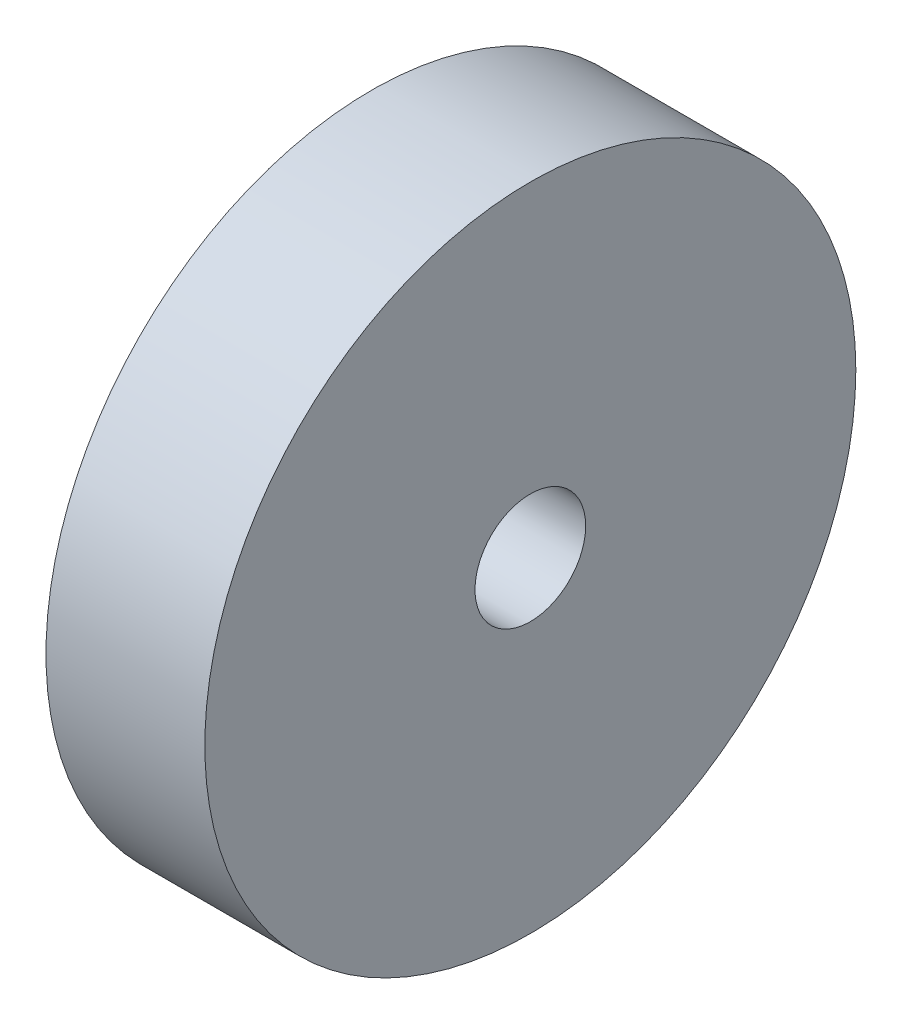
ISO-10303-21;
HEADER;
FILE_DESCRIPTION(('STEP AP214'),'2;1');
FILE_NAME('part.step','',(''),(''),'','','');
FILE_SCHEMA(('AUTOMOTIVE_DESIGN { 1 0 10303 214 1 1 1 1 }'));
ENDSEC;
DATA;
#1=APPLICATION_CONTEXT('core data for automotive mechanical design processes');
#2=APPLICATION_PROTOCOL_DEFINITION('international standard','automotive_design',2000,#1);
#3=PRODUCT_CONTEXT('',#1,'mechanical');
#4=PRODUCT('Part','Part','',(#3));
#5=PRODUCT_RELATED_PRODUCT_CATEGORY('part','',(#4));
#6=PRODUCT_DEFINITION_FORMATION('','',#4);
#7=PRODUCT_DEFINITION_CONTEXT('part definition',#1,'design');
#8=PRODUCT_DEFINITION('design','',#6,#7);
#9=PRODUCT_DEFINITION_SHAPE('','',#8);
#10=(LENGTH_UNIT() NAMED_UNIT(*) SI_UNIT(.MILLI.,.METRE.));
#11=(NAMED_UNIT(*) PLANE_ANGLE_UNIT() SI_UNIT($,.RADIAN.));
#12=(NAMED_UNIT(*) SI_UNIT($,.STERADIAN.) SOLID_ANGLE_UNIT());
#13=UNCERTAINTY_MEASURE_WITH_UNIT(LENGTH_MEASURE(1.E-05),#10,'distance_accuracy_value','');
#14=(GEOMETRIC_REPRESENTATION_CONTEXT(3) GLOBAL_UNCERTAINTY_ASSIGNED_CONTEXT((#13)) GLOBAL_UNIT_ASSIGNED_CONTEXT((#10,
#11,#12)) REPRESENTATION_CONTEXT('',''));
#15=CARTESIAN_POINT('',(0.,0.,0.));
#16=DIRECTION('',(0.,0.,1.));
#17=DIRECTION('',(1.,0.,0.));
#18=AXIS2_PLACEMENT_3D('',#15,#16,#17);
#19=CARTESIAN_POINT('',(6.1976,0.,0.));
#20=DIRECTION('',(-1.,0.,0.));
#21=DIRECTION('',(0.,0.,1.));
#22=AXIS2_PLACEMENT_3D('',#19,#20,#21);
#23=CYLINDRICAL_SURFACE('',#22,6.35);
#24=CARTESIAN_POINT('',(6.1976,0.,0.));
#25=DIRECTION('',(1.,0.,0.));
#26=DIRECTION('',(0.,0.,-1.));
#27=AXIS2_PLACEMENT_3D('',#24,#25,#26);
#28=CIRCLE('',#27,6.35);
#29=CARTESIAN_POINT('',(6.1976,0.,-6.35));
#30=VERTEX_POINT('',#29);
#31=EDGE_CURVE('E10',#30,#30,#28,.T.);
#32=ORIENTED_EDGE('',*,*,#31,.F.);
#33=EDGE_LOOP('',(#32));
#34=FACE_BOUND('',#33,.T.);
#35=CARTESIAN_POINT('',(3.0988,0.,0.));
#36=DIRECTION('',(1.,0.,0.));
#37=DIRECTION('',(0.,0.,-1.));
#38=AXIS2_PLACEMENT_3D('',#35,#36,#37);
#39=CIRCLE('',#38,6.35);
#40=CARTESIAN_POINT('',(3.0988,0.,-6.35));
#41=VERTEX_POINT('',#40);
#42=EDGE_CURVE('E37',#41,#41,#39,.T.);
#43=ORIENTED_EDGE('',*,*,#42,.T.);
#44=EDGE_LOOP('',(#43));
#45=FACE_BOUND('',#44,.T.);
#46=ADVANCED_FACE('F30',(#34,#45),#23,.T.);
#47=CARTESIAN_POINT('',(6.1976,0.,0.));
#48=DIRECTION('',(1.,0.,0.));
#49=DIRECTION('',(0.,0.,-1.));
#50=AXIS2_PLACEMENT_3D('',#47,#48,#49);
#51=PLANE('',#50);
#52=CARTESIAN_POINT('',(6.1976,0.,0.));
#53=DIRECTION('',(1.,0.,0.));
#54=DIRECTION('',(0.,0.,-1.));
#55=AXIS2_PLACEMENT_3D('',#52,#53,#54);
#56=CIRCLE('',#55,1.0795);
#57=CARTESIAN_POINT('',(6.1976,0.,-1.0795));
#58=VERTEX_POINT('',#57);
#59=EDGE_CURVE('E42',#58,#58,#56,.T.);
#60=ORIENTED_EDGE('',*,*,#59,.F.);
#61=EDGE_LOOP('',(#60));
#62=FACE_BOUND('',#61,.T.);
#63=ORIENTED_EDGE('',*,*,#31,.T.);
#64=EDGE_LOOP('',(#63));
#65=FACE_BOUND('',#64,.T.);
#66=ADVANCED_FACE('F59',(#62,#65),#51,.T.);
#67=CARTESIAN_POINT('',(3.0988,0.,0.));
#68=DIRECTION('',(1.,0.,0.));
#69=DIRECTION('',(0.,0.,-1.));
#70=AXIS2_PLACEMENT_3D('',#67,#68,#69);
#71=PLANE('',#70);
#72=CARTESIAN_POINT('',(3.0988,0.,0.));
#73=DIRECTION('',(1.,0.,0.));
#74=DIRECTION('',(0.,0.,-1.));
#75=AXIS2_PLACEMENT_3D('',#72,#73,#74);
#76=CIRCLE('',#75,1.0795);
#77=CARTESIAN_POINT('',(3.0988,0.,-1.0795));
#78=VERTEX_POINT('',#77);
#79=EDGE_CURVE('E33',#78,#78,#76,.T.);
#80=ORIENTED_EDGE('',*,*,#79,.T.);
#81=EDGE_LOOP('',(#80));
#82=FACE_BOUND('',#81,.T.);
#83=ORIENTED_EDGE('',*,*,#42,.F.);
#84=EDGE_LOOP('',(#83));
#85=FACE_BOUND('',#84,.T.);
#86=ADVANCED_FACE('F50',(#82,#85),#71,.F.);
#87=CARTESIAN_POINT('',(0.,0.,0.));
#88=DIRECTION('',(1.,0.,0.));
#89=DIRECTION('',(0.,0.,-1.));
#90=AXIS2_PLACEMENT_3D('',#87,#88,#89);
#91=CYLINDRICAL_SURFACE('',#90,1.0795);
#92=CARTESIAN_POINT('',(6.1976,0.,-1.0795));
#93=CARTESIAN_POINT('',(6.16532083333333,0.,-1.0795));
#94=CARTESIAN_POINT('',(6.13304166666667,0.,-1.0795));
#95=CARTESIAN_POINT('',(6.06848333333333,0.,-1.0795));
#96=CARTESIAN_POINT('',(6.03620416666667,0.,-1.0795));
#97=CARTESIAN_POINT('',(5.97164583333333,0.,-1.0795));
#98=CARTESIAN_POINT('',(5.93936666666667,0.,-1.0795));
#99=CARTESIAN_POINT('',(5.87480833333333,0.,-1.0795));
#100=CARTESIAN_POINT('',(5.84252916666667,0.,-1.0795));
#101=CARTESIAN_POINT('',(5.77797083333333,0.,-1.0795));
#102=CARTESIAN_POINT('',(5.74569166666666,0.,-1.0795));
#103=CARTESIAN_POINT('',(5.68113333333333,0.,-1.0795));
#104=CARTESIAN_POINT('',(5.64885416666666,0.,-1.0795));
#105=CARTESIAN_POINT('',(5.58429583333333,0.,-1.0795));
#106=CARTESIAN_POINT('',(5.55201666666667,0.,-1.0795));
#107=CARTESIAN_POINT('',(5.48745833333333,0.,-1.0795));
#108=CARTESIAN_POINT('',(5.45517916666666,0.,-1.0795));
#109=CARTESIAN_POINT('',(5.39062083333333,0.,-1.0795));
#110=CARTESIAN_POINT('',(5.35834166666667,0.,-1.0795));
#111=CARTESIAN_POINT('',(5.29378333333333,0.,-1.0795));
#112=CARTESIAN_POINT('',(5.26150416666666,0.,-1.0795));
#113=CARTESIAN_POINT('',(5.19694583333333,0.,-1.0795));
#114=CARTESIAN_POINT('',(5.16466666666667,0.,-1.0795));
#115=CARTESIAN_POINT('',(5.10010833333333,0.,-1.0795));
#116=CARTESIAN_POINT('',(5.06782916666667,0.,-1.0795));
#117=CARTESIAN_POINT('',(5.00327083333333,0.,-1.0795));
#118=CARTESIAN_POINT('',(4.97099166666667,0.,-1.0795));
#119=CARTESIAN_POINT('',(4.90643333333333,0.,-1.0795));
#120=CARTESIAN_POINT('',(4.87415416666667,0.,-1.0795));
#121=CARTESIAN_POINT('',(4.80959583333333,0.,-1.0795));
#122=CARTESIAN_POINT('',(4.77731666666666,0.,-1.0795));
#123=CARTESIAN_POINT('',(4.71275833333333,0.,-1.0795));
#124=CARTESIAN_POINT('',(4.68047916666667,0.,-1.0795));
#125=CARTESIAN_POINT('',(4.61592083333333,0.,-1.0795));
#126=CARTESIAN_POINT('',(4.58364166666667,0.,-1.0795));
#127=CARTESIAN_POINT('',(4.51908333333333,0.,-1.0795));
#128=CARTESIAN_POINT('',(4.48680416666667,0.,-1.0795));
#129=CARTESIAN_POINT('',(4.42224583333333,0.,-1.0795));
#130=CARTESIAN_POINT('',(4.38996666666667,0.,-1.0795));
#131=CARTESIAN_POINT('',(4.32540833333333,0.,-1.0795));
#132=CARTESIAN_POINT('',(4.29312916666667,0.,-1.0795));
#133=CARTESIAN_POINT('',(4.22857083333333,0.,-1.0795));
#134=CARTESIAN_POINT('',(4.19629166666667,0.,-1.0795));
#135=CARTESIAN_POINT('',(4.13173333333333,0.,-1.0795));
#136=CARTESIAN_POINT('',(4.09945416666667,0.,-1.0795));
#137=CARTESIAN_POINT('',(4.03489583333333,0.,-1.0795));
#138=CARTESIAN_POINT('',(4.00261666666666,0.,-1.0795));
#139=CARTESIAN_POINT('',(3.93805833333333,0.,-1.0795));
#140=CARTESIAN_POINT('',(3.90577916666667,0.,-1.0795));
#141=CARTESIAN_POINT('',(3.84122083333333,0.,-1.0795));
#142=CARTESIAN_POINT('',(3.80894166666667,0.,-1.0795));
#143=CARTESIAN_POINT('',(3.74438333333333,0.,-1.0795));
#144=CARTESIAN_POINT('',(3.71210416666667,0.,-1.0795));
#145=CARTESIAN_POINT('',(3.64754583333333,0.,-1.0795));
#146=CARTESIAN_POINT('',(3.61526666666667,0.,-1.0795));
#147=CARTESIAN_POINT('',(3.55070833333333,0.,-1.0795));
#148=CARTESIAN_POINT('',(3.51842916666667,0.,-1.0795));
#149=CARTESIAN_POINT('',(3.45387083333333,0.,-1.0795));
#150=CARTESIAN_POINT('',(3.42159166666667,0.,-1.0795));
#151=CARTESIAN_POINT('',(3.35703333333333,0.,-1.0795));
#152=CARTESIAN_POINT('',(3.32475416666667,0.,-1.0795));
#153=CARTESIAN_POINT('',(3.26019583333333,0.,-1.0795));
#154=CARTESIAN_POINT('',(3.22791666666667,0.,-1.0795));
#155=CARTESIAN_POINT('',(3.16335833333333,0.,-1.0795));
#156=CARTESIAN_POINT('',(3.13107916666667,0.,-1.0795));
#157=CARTESIAN_POINT('',(3.0988,0.,-1.0795));
#158=B_SPLINE_CURVE_WITH_KNOTS('',3,(#92,#93,#94,#95,#96,#97,#98,#99,#100,#101,#102,#103,#104,
#105,#106,#107,#108,#109,#110,#111,#112,#113,#114,#115,#116,#117,#118,#119,#120,#121,#122,#123,
#124,#125,#126,#127,#128,#129,#130,#131,#132,#133,#134,#135,#136,#137,#138,#139,#140,#141,#142,
#143,#144,#145,#146,#147,#148,#149,#150,#151,#152,#153,#154,#155,#156,#157),.UNSPECIFIED.,.F.,
.F.,(4,2,2,2,2,2,2,2,2,2,2,2,2,2,2,2,2,2,2,2,2,2,2,2,2,2,2,2,2,2,2,2,4),(0.,0.0968375000000004,
0.193675,0.2905125,0.38735,0.4841875,0.581025,0.6778625,0.7747,0.8715375,0.968375,1.0652125,
1.16205,1.2588875,1.355725,1.4525625,1.5494,1.6462375,1.743075,1.8399125,1.93675,2.0335875,
2.130425,2.2272625,2.3241,2.4209375,2.517775,2.6146125,2.71145,2.8082875,2.905125,3.0019625,
3.0988),.UNSPECIFIED.);
#159=EDGE_CURVE('BSEAM53',#58,#78,#158,.T.);
#160=ORIENTED_EDGE('',*,*,#59,.T.);
#161=ORIENTED_EDGE('',*,*,#79,.F.);
#162=ORIENTED_EDGE('',*,*,#159,.T.);
#163=ORIENTED_EDGE('',*,*,#159,.F.);
#164=EDGE_LOOP('',(#160,#162,#161,#163));
#165=FACE_BOUND('',#164,.T.);
#166=ADVANCED_FACE('F53',(#165),#91,.F.);
#167=CLOSED_SHELL('',(#46,#66,#86,#166));
#168=MANIFOLD_SOLID_BREP('B2',#167);
#169=ADVANCED_BREP_SHAPE_REPRESENTATION('',(#18,#168),#14);
#170=SHAPE_DEFINITION_REPRESENTATION(#9,#169);
ENDSEC;
END-ISO-10303-21;
